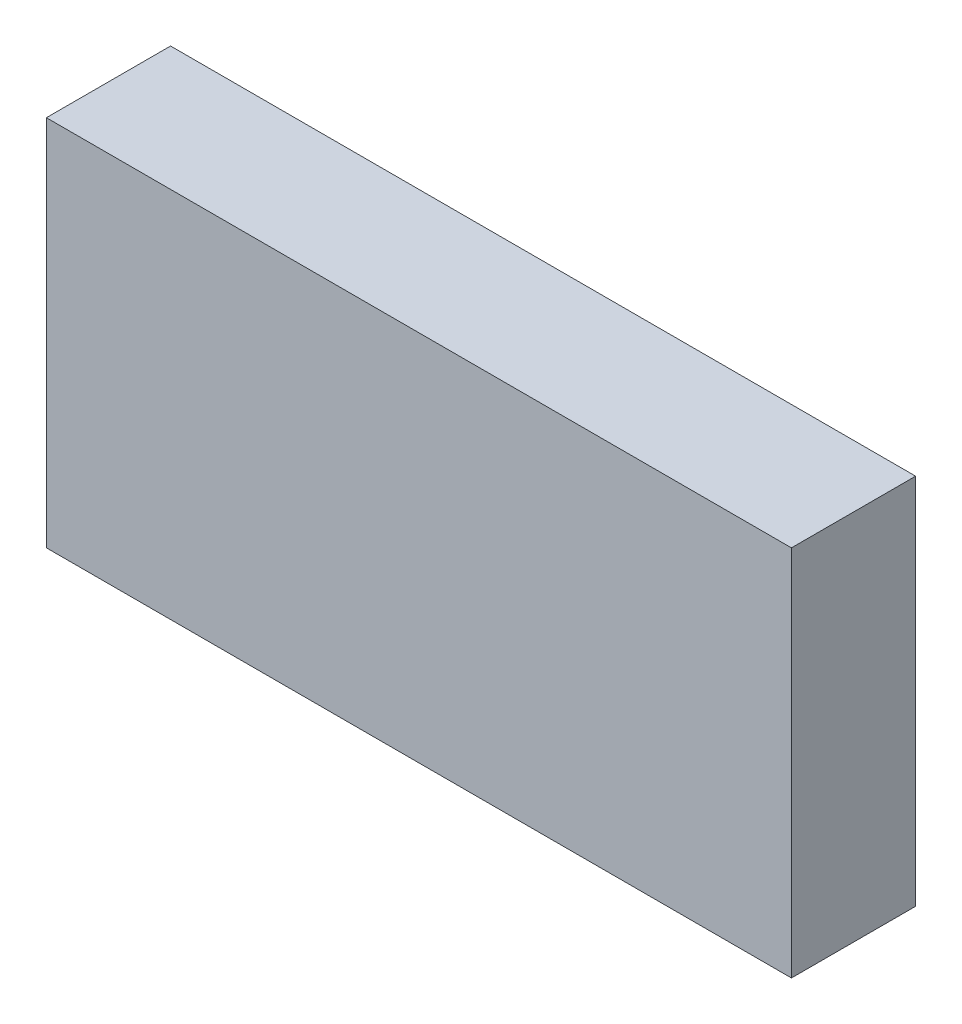
ISO-10303-21;
HEADER;
FILE_DESCRIPTION(('STEP AP214'),'2;1');
FILE_NAME('part.step','',(''),(''),'','','');
FILE_SCHEMA(('AUTOMOTIVE_DESIGN { 1 0 10303 214 1 1 1 1 }'));
ENDSEC;
DATA;
#1=APPLICATION_CONTEXT('core data for automotive mechanical design processes');
#2=APPLICATION_PROTOCOL_DEFINITION('international standard','automotive_design',2000,#1);
#3=PRODUCT_CONTEXT('',#1,'mechanical');
#4=PRODUCT('Part','Part','',(#3));
#5=PRODUCT_RELATED_PRODUCT_CATEGORY('part','',(#4));
#6=PRODUCT_DEFINITION_FORMATION('','',#4);
#7=PRODUCT_DEFINITION_CONTEXT('part definition',#1,'design');
#8=PRODUCT_DEFINITION('design','',#6,#7);
#9=PRODUCT_DEFINITION_SHAPE('','',#8);
#10=(LENGTH_UNIT() NAMED_UNIT(*) SI_UNIT(.MILLI.,.METRE.));
#11=(NAMED_UNIT(*) PLANE_ANGLE_UNIT() SI_UNIT($,.RADIAN.));
#12=(NAMED_UNIT(*) SI_UNIT($,.STERADIAN.) SOLID_ANGLE_UNIT());
#13=UNCERTAINTY_MEASURE_WITH_UNIT(LENGTH_MEASURE(1.E-05),#10,'distance_accuracy_value','');
#14=(GEOMETRIC_REPRESENTATION_CONTEXT(3) GLOBAL_UNCERTAINTY_ASSIGNED_CONTEXT((#13)) GLOBAL_UNIT_ASSIGNED_CONTEXT((#10,
#11,#12)) REPRESENTATION_CONTEXT('',''));
#15=CARTESIAN_POINT('',(0.,0.,0.));
#16=DIRECTION('',(0.,0.,1.));
#17=DIRECTION('',(1.,0.,0.));
#18=AXIS2_PLACEMENT_3D('',#15,#16,#17);
#19=CARTESIAN_POINT('',(45.,-22.5,15.));
#20=DIRECTION('',(-1.,0.,0.));
#21=DIRECTION('',(0.,0.,1.));
#22=AXIS2_PLACEMENT_3D('',#19,#20,#21);
#23=PLANE('',#22);
#24=DIRECTION('',(0.,1.,0.));
#25=VECTOR('',#24,1.);
#26=CARTESIAN_POINT('',(45.,-22.5,0.));
#27=LINE('',#26,#25);
#28=CARTESIAN_POINT('',(45.,-22.5,0.));
#29=VERTEX_POINT('',#28);
#30=CARTESIAN_POINT('',(45.,22.5,0.));
#31=VERTEX_POINT('',#30);
#32=EDGE_CURVE('E96',#29,#31,#27,.T.);
#33=ORIENTED_EDGE('',*,*,#32,.T.);
#34=DIRECTION('',(0.,0.,-1.));
#35=VECTOR('',#34,1.);
#36=CARTESIAN_POINT('',(45.,22.5,15.));
#37=LINE('',#36,#35);
#38=CARTESIAN_POINT('',(45.,22.5,15.));
#39=VERTEX_POINT('',#38);
#40=EDGE_CURVE('E11',#39,#31,#37,.T.);
#41=ORIENTED_EDGE('',*,*,#40,.F.);
#42=DIRECTION('',(0.,1.,0.));
#43=VECTOR('',#42,1.);
#44=CARTESIAN_POINT('',(45.,-22.5,15.));
#45=LINE('',#44,#43);
#46=CARTESIAN_POINT('',(45.,-22.5,15.));
#47=VERTEX_POINT('',#46);
#48=EDGE_CURVE('E84',#47,#39,#45,.T.);
#49=ORIENTED_EDGE('',*,*,#48,.F.);
#50=DIRECTION('',(0.,0.,-1.));
#51=VECTOR('',#50,1.);
#52=CARTESIAN_POINT('',(45.,-22.5,15.));
#53=LINE('',#52,#51);
#54=EDGE_CURVE('E92',#47,#29,#53,.T.);
#55=ORIENTED_EDGE('',*,*,#54,.T.);
#56=EDGE_LOOP('',(#33,#41,#49,#55));
#57=FACE_BOUND('',#56,.T.);
#58=ADVANCED_FACE('F33',(#57),#23,.F.);
#59=CARTESIAN_POINT('',(-45.,22.5,15.));
#60=DIRECTION('',(0.,-1.,0.));
#61=DIRECTION('',(0.,0.,-1.));
#62=AXIS2_PLACEMENT_3D('',#59,#60,#61);
#63=PLANE('',#62);
#64=DIRECTION('',(-1.,0.,0.));
#65=VECTOR('',#64,1.);
#66=CARTESIAN_POINT('',(-45.,22.5,0.));
#67=LINE('',#66,#65);
#68=CARTESIAN_POINT('',(-45.,22.5,0.));
#69=VERTEX_POINT('',#68);
#70=EDGE_CURVE('E88',#31,#69,#67,.T.);
#71=ORIENTED_EDGE('',*,*,#70,.T.);
#72=DIRECTION('',(0.,0.,-1.));
#73=VECTOR('',#72,1.);
#74=CARTESIAN_POINT('',(-45.,22.5,15.));
#75=LINE('',#74,#73);
#76=CARTESIAN_POINT('',(-45.,22.5,15.));
#77=VERTEX_POINT('',#76);
#78=EDGE_CURVE('E41',#77,#69,#75,.T.);
#79=ORIENTED_EDGE('',*,*,#78,.F.);
#80=DIRECTION('',(-1.,0.,0.));
#81=VECTOR('',#80,1.);
#82=CARTESIAN_POINT('',(-45.,22.5,15.));
#83=LINE('',#82,#81);
#84=EDGE_CURVE('E79',#39,#77,#83,.T.);
#85=ORIENTED_EDGE('',*,*,#84,.F.);
#86=ORIENTED_EDGE('',*,*,#40,.T.);
#87=EDGE_LOOP('',(#71,#79,#85,#86));
#88=FACE_BOUND('',#87,.T.);
#89=ADVANCED_FACE('F87',(#88),#63,.F.);
#90=CARTESIAN_POINT('',(-45.,-22.5,15.));
#91=DIRECTION('',(1.,0.,0.));
#92=DIRECTION('',(0.,0.,-1.));
#93=AXIS2_PLACEMENT_3D('',#90,#91,#92);
#94=PLANE('',#93);
#95=DIRECTION('',(0.,-1.,0.));
#96=VECTOR('',#95,1.);
#97=CARTESIAN_POINT('',(-45.,-22.5,0.));
#98=LINE('',#97,#96);
#99=CARTESIAN_POINT('',(-45.,-22.5,0.));
#100=VERTEX_POINT('',#99);
#101=EDGE_CURVE('E66',#69,#100,#98,.T.);
#102=ORIENTED_EDGE('',*,*,#101,.T.);
#103=DIRECTION('',(0.,0.,-1.));
#104=VECTOR('',#103,1.);
#105=CARTESIAN_POINT('',(-45.,-22.5,15.));
#106=LINE('',#105,#104);
#107=CARTESIAN_POINT('',(-45.,-22.5,15.));
#108=VERTEX_POINT('',#107);
#109=EDGE_CURVE('E89',#108,#100,#106,.T.);
#110=ORIENTED_EDGE('',*,*,#109,.F.);
#111=DIRECTION('',(0.,-1.,0.));
#112=VECTOR('',#111,1.);
#113=CARTESIAN_POINT('',(-45.,-22.5,15.));
#114=LINE('',#113,#112);
#115=EDGE_CURVE('E82',#77,#108,#114,.T.);
#116=ORIENTED_EDGE('',*,*,#115,.F.);
#117=ORIENTED_EDGE('',*,*,#78,.T.);
#118=EDGE_LOOP('',(#102,#110,#116,#117));
#119=FACE_BOUND('',#118,.T.);
#120=ADVANCED_FACE('F90',(#119),#94,.F.);
#121=CARTESIAN_POINT('',(-45.,-22.5,15.));
#122=DIRECTION('',(0.,1.,0.));
#123=DIRECTION('',(0.,0.,1.));
#124=AXIS2_PLACEMENT_3D('',#121,#122,#123);
#125=PLANE('',#124);
#126=DIRECTION('',(1.,0.,0.));
#127=VECTOR('',#126,1.);
#128=CARTESIAN_POINT('',(-45.,-22.5,0.));
#129=LINE('',#128,#127);
#130=EDGE_CURVE('E72',#100,#29,#129,.T.);
#131=ORIENTED_EDGE('',*,*,#130,.T.);
#132=ORIENTED_EDGE('',*,*,#54,.F.);
#133=DIRECTION('',(1.,0.,0.));
#134=VECTOR('',#133,1.);
#135=CARTESIAN_POINT('',(-45.,-22.5,15.));
#136=LINE('',#135,#134);
#137=EDGE_CURVE('E49',#108,#47,#136,.T.);
#138=ORIENTED_EDGE('',*,*,#137,.F.);
#139=ORIENTED_EDGE('',*,*,#109,.T.);
#140=EDGE_LOOP('',(#131,#132,#138,#139));
#141=FACE_BOUND('',#140,.T.);
#142=ADVANCED_FACE('F103',(#141),#125,.F.);
#143=CARTESIAN_POINT('',(0.,0.,15.));
#144=DIRECTION('',(0.,0.,-1.));
#145=DIRECTION('',(-1.,0.,0.));
#146=AXIS2_PLACEMENT_3D('',#143,#144,#145);
#147=PLANE('',#146);
#148=ORIENTED_EDGE('',*,*,#48,.T.);
#149=ORIENTED_EDGE('',*,*,#84,.T.);
#150=ORIENTED_EDGE('',*,*,#115,.T.);
#151=ORIENTED_EDGE('',*,*,#137,.T.);
#152=EDGE_LOOP('',(#148,#149,#150,#151));
#153=FACE_BOUND('',#152,.T.);
#154=ADVANCED_FACE('F80',(#153),#147,.F.);
#155=CARTESIAN_POINT('',(0.,0.,0.));
#156=DIRECTION('',(0.,0.,-1.));
#157=DIRECTION('',(-1.,0.,0.));
#158=AXIS2_PLACEMENT_3D('',#155,#156,#157);
#159=PLANE('',#158);
#160=ORIENTED_EDGE('',*,*,#32,.F.);
#161=ORIENTED_EDGE('',*,*,#130,.F.);
#162=ORIENTED_EDGE('',*,*,#101,.F.);
#163=ORIENTED_EDGE('',*,*,#70,.F.);
#164=EDGE_LOOP('',(#160,#161,#162,#163));
#165=FACE_BOUND('',#164,.T.);
#166=ADVANCED_FACE('F106',(#165),#159,.T.);
#167=CLOSED_SHELL('',(#58,#89,#120,#142,#154,#166));
#168=MANIFOLD_SOLID_BREP('B2',#167);
#169=ADVANCED_BREP_SHAPE_REPRESENTATION('',(#18,#168),#14);
#170=SHAPE_DEFINITION_REPRESENTATION(#9,#169);
ENDSEC;
END-ISO-10303-21;
